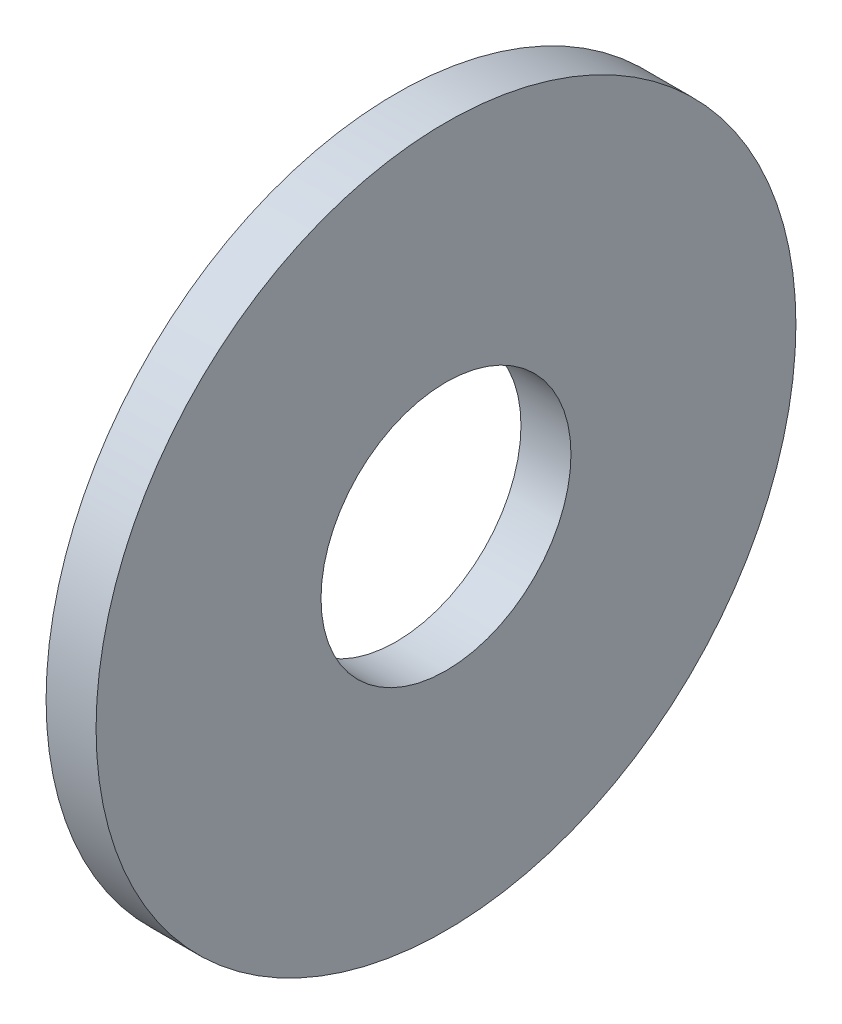
ISO-10303-21;
HEADER;
FILE_DESCRIPTION(('STEP AP214'),'2;1');
FILE_NAME('part.step','',(''),(''),'','','');
FILE_SCHEMA(('AUTOMOTIVE_DESIGN { 1 0 10303 214 1 1 1 1 }'));
ENDSEC;
DATA;
#1=APPLICATION_CONTEXT('core data for automotive mechanical design processes');
#2=APPLICATION_PROTOCOL_DEFINITION('international standard','automotive_design',2000,#1);
#3=PRODUCT_CONTEXT('',#1,'mechanical');
#4=PRODUCT('Part','Part','',(#3));
#5=PRODUCT_RELATED_PRODUCT_CATEGORY('part','',(#4));
#6=PRODUCT_DEFINITION_FORMATION('','',#4);
#7=PRODUCT_DEFINITION_CONTEXT('part definition',#1,'design');
#8=PRODUCT_DEFINITION('design','',#6,#7);
#9=PRODUCT_DEFINITION_SHAPE('','',#8);
#10=(LENGTH_UNIT() NAMED_UNIT(*) SI_UNIT(.MILLI.,.METRE.));
#11=(NAMED_UNIT(*) PLANE_ANGLE_UNIT() SI_UNIT($,.RADIAN.));
#12=(NAMED_UNIT(*) SI_UNIT($,.STERADIAN.) SOLID_ANGLE_UNIT());
#13=UNCERTAINTY_MEASURE_WITH_UNIT(LENGTH_MEASURE(1.E-05),#10,'distance_accuracy_value','');
#14=(GEOMETRIC_REPRESENTATION_CONTEXT(3) GLOBAL_UNCERTAINTY_ASSIGNED_CONTEXT((#13)) GLOBAL_UNIT_ASSIGNED_CONTEXT((#10,
#11,#12)) REPRESENTATION_CONTEXT('',''));
#15=CARTESIAN_POINT('',(0.,0.,0.));
#16=DIRECTION('',(0.,0.,1.));
#17=DIRECTION('',(1.,0.,0.));
#18=AXIS2_PLACEMENT_3D('',#15,#16,#17);
#19=CARTESIAN_POINT('',(1.,0.,0.));
#20=DIRECTION('',(1.,0.,0.));
#21=DIRECTION('',(0.,0.,-1.));
#22=AXIS2_PLACEMENT_3D('',#19,#20,#21);
#23=PLANE('',#22);
#24=CARTESIAN_POINT('',(1.,0.,0.));
#25=DIRECTION('',(1.,0.,0.));
#26=DIRECTION('',(0.,0.,-1.));
#27=AXIS2_PLACEMENT_3D('',#24,#25,#26);
#28=CIRCLE('',#27,7.);
#29=CARTESIAN_POINT('',(1.,0.,-7.));
#30=VERTEX_POINT('',#29);
#31=EDGE_CURVE('E10',#30,#30,#28,.T.);
#32=ORIENTED_EDGE('',*,*,#31,.T.);
#33=EDGE_LOOP('',(#32));
#34=FACE_BOUND('',#33,.T.);
#35=CARTESIAN_POINT('',(1.,0.,0.));
#36=DIRECTION('',(1.,0.,0.));
#37=DIRECTION('',(0.,0.,-1.));
#38=AXIS2_PLACEMENT_3D('',#35,#36,#37);
#39=CIRCLE('',#38,2.5);
#40=CARTESIAN_POINT('',(1.,0.,-2.5));
#41=VERTEX_POINT('',#40);
#42=EDGE_CURVE('E42',#41,#41,#39,.T.);
#43=ORIENTED_EDGE('',*,*,#42,.F.);
#44=EDGE_LOOP('',(#43));
#45=FACE_BOUND('',#44,.T.);
#46=ADVANCED_FACE('F31',(#34,#45),#23,.T.);
#47=CARTESIAN_POINT('',(0.,0.,0.));
#48=DIRECTION('',(1.,0.,0.));
#49=DIRECTION('',(0.,0.,-1.));
#50=AXIS2_PLACEMENT_3D('',#47,#48,#49);
#51=PLANE('',#50);
#52=CARTESIAN_POINT('',(0.,0.,0.));
#53=DIRECTION('',(1.,0.,0.));
#54=DIRECTION('',(0.,0.,-1.));
#55=AXIS2_PLACEMENT_3D('',#52,#53,#54);
#56=CIRCLE('',#55,7.);
#57=CARTESIAN_POINT('',(0.,0.,-7.));
#58=VERTEX_POINT('',#57);
#59=EDGE_CURVE('E35',#58,#58,#56,.T.);
#60=ORIENTED_EDGE('',*,*,#59,.F.);
#61=EDGE_LOOP('',(#60));
#62=FACE_BOUND('',#61,.T.);
#63=CARTESIAN_POINT('',(0.,0.,0.));
#64=DIRECTION('',(1.,0.,0.));
#65=DIRECTION('',(0.,0.,-1.));
#66=AXIS2_PLACEMENT_3D('',#63,#64,#65);
#67=CIRCLE('',#66,2.5);
#68=CARTESIAN_POINT('',(0.,0.,-2.5));
#69=VERTEX_POINT('',#68);
#70=EDGE_CURVE('E44',#69,#69,#67,.T.);
#71=ORIENTED_EDGE('',*,*,#70,.T.);
#72=EDGE_LOOP('',(#71));
#73=FACE_BOUND('',#72,.T.);
#74=ADVANCED_FACE('F54',(#62,#73),#51,.F.);
#75=CARTESIAN_POINT('',(1.,0.,0.));
#76=DIRECTION('',(-1.,0.,0.));
#77=DIRECTION('',(0.,0.,1.));
#78=AXIS2_PLACEMENT_3D('',#75,#76,#77);
#79=CYLINDRICAL_SURFACE('',#78,7.);
#80=ORIENTED_EDGE('',*,*,#31,.F.);
#81=EDGE_LOOP('',(#80));
#82=FACE_BOUND('',#81,.T.);
#83=ORIENTED_EDGE('',*,*,#59,.T.);
#84=EDGE_LOOP('',(#83));
#85=FACE_BOUND('',#84,.T.);
#86=ADVANCED_FACE('F33',(#82,#85),#79,.T.);
#87=CARTESIAN_POINT('',(1.,0.,0.));
#88=DIRECTION('',(-1.,0.,0.));
#89=DIRECTION('',(0.,0.,1.));
#90=AXIS2_PLACEMENT_3D('',#87,#88,#89);
#91=CYLINDRICAL_SURFACE('',#90,2.5);
#92=ORIENTED_EDGE('',*,*,#42,.T.);
#93=EDGE_LOOP('',(#92));
#94=FACE_BOUND('',#93,.T.);
#95=ORIENTED_EDGE('',*,*,#70,.F.);
#96=EDGE_LOOP('',(#95));
#97=FACE_BOUND('',#96,.T.);
#98=ADVANCED_FACE('F50',(#94,#97),#91,.F.);
#99=CLOSED_SHELL('',(#46,#74,#86,#98));
#100=MANIFOLD_SOLID_BREP('B2',#99);
#101=ADVANCED_BREP_SHAPE_REPRESENTATION('',(#18,#100),#14);
#102=SHAPE_DEFINITION_REPRESENTATION(#9,#101);
ENDSEC;
END-ISO-10303-21;
